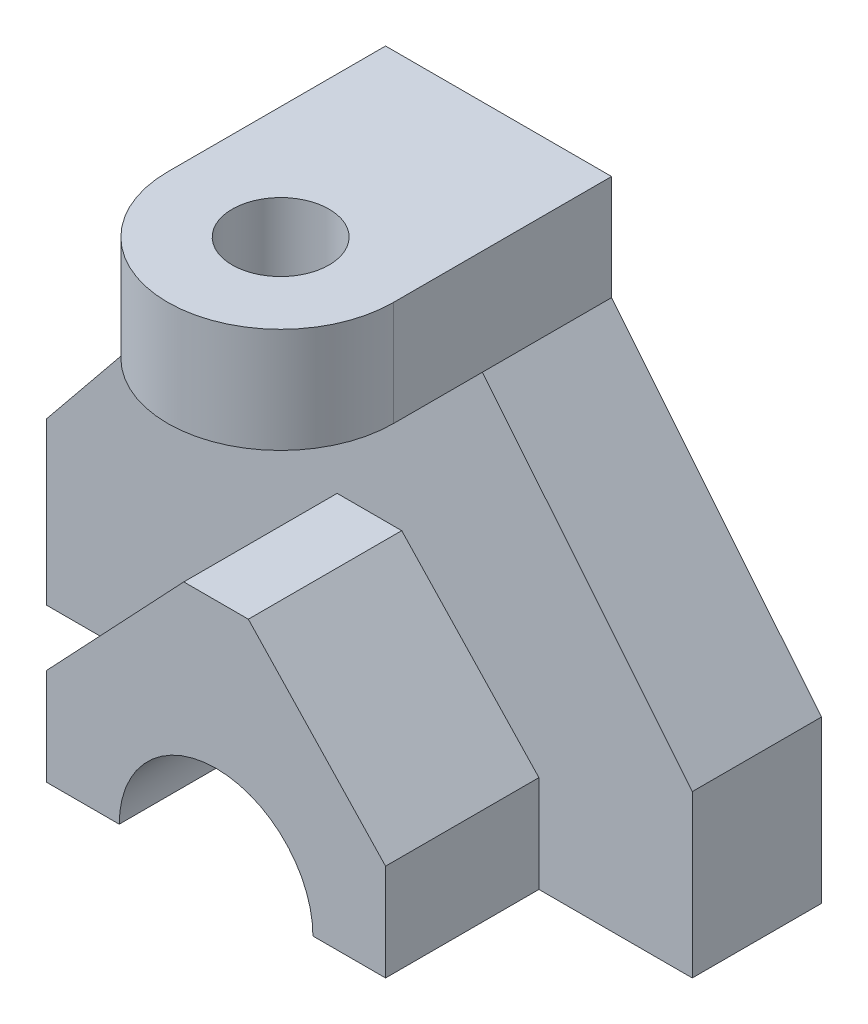
ISO-10303-21;
HEADER;
FILE_DESCRIPTION(('STEP AP214'),'2;1');
FILE_NAME('part.step','',(''),(''),'','','');
FILE_SCHEMA(('AUTOMOTIVE_DESIGN { 1 0 10303 214 1 1 1 1 }'));
ENDSEC;
DATA;
#1=APPLICATION_CONTEXT('core data for automotive mechanical design processes');
#2=APPLICATION_PROTOCOL_DEFINITION('international standard','automotive_design',2000,#1);
#3=PRODUCT_CONTEXT('',#1,'mechanical');
#4=PRODUCT('Part','Part','',(#3));
#5=PRODUCT_RELATED_PRODUCT_CATEGORY('part','',(#4));
#6=PRODUCT_DEFINITION_FORMATION('','',#4);
#7=PRODUCT_DEFINITION_CONTEXT('part definition',#1,'design');
#8=PRODUCT_DEFINITION('design','',#6,#7);
#9=PRODUCT_DEFINITION_SHAPE('','',#8);
#10=(LENGTH_UNIT() NAMED_UNIT(*) SI_UNIT(.MILLI.,.METRE.));
#11=(NAMED_UNIT(*) PLANE_ANGLE_UNIT() SI_UNIT($,.RADIAN.));
#12=(NAMED_UNIT(*) SI_UNIT($,.STERADIAN.) SOLID_ANGLE_UNIT());
#13=UNCERTAINTY_MEASURE_WITH_UNIT(LENGTH_MEASURE(1.E-05),#10,'distance_accuracy_value','');
#14=(GEOMETRIC_REPRESENTATION_CONTEXT(3) GLOBAL_UNCERTAINTY_ASSIGNED_CONTEXT((#13)) GLOBAL_UNIT_ASSIGNED_CONTEXT((#10,
#11,#12)) REPRESENTATION_CONTEXT('',''));
#15=CARTESIAN_POINT('',(0.,0.,0.));
#16=DIRECTION('',(0.,0.,1.));
#17=DIRECTION('',(1.,0.,0.));
#18=AXIS2_PLACEMENT_3D('',#15,#16,#17);
#19=CARTESIAN_POINT('',(0.,0.,16.));
#20=DIRECTION('',(0.,1.,0.));
#21=DIRECTION('',(0.,0.,1.));
#22=AXIS2_PLACEMENT_3D('',#19,#20,#21);
#23=PLANE('',#22);
#24=DIRECTION('',(1.,0.,0.));
#25=VECTOR('',#24,1.);
#26=CARTESIAN_POINT('',(0.,0.,0.));
#27=LINE('',#26,#25);
#28=CARTESIAN_POINT('',(-40.,0.,0.));
#29=VERTEX_POINT('',#28);
#30=CARTESIAN_POINT('',(-12.,0.,0.));
#31=VERTEX_POINT('',#30);
#32=EDGE_CURVE('E176',#29,#31,#27,.T.);
#33=ORIENTED_EDGE('',*,*,#32,.T.);
#34=DIRECTION('',(0.,0.,1.));
#35=VECTOR('',#34,1.);
#36=CARTESIAN_POINT('',(-12.,0.,0.));
#37=LINE('',#36,#35);
#38=CARTESIAN_POINT('',(-12.,0.,35.));
#39=VERTEX_POINT('',#38);
#40=EDGE_CURVE('E160',#31,#39,#37,.T.);
#41=ORIENTED_EDGE('',*,*,#40,.T.);
#42=DIRECTION('',(1.,0.,0.));
#43=VECTOR('',#42,1.);
#44=CARTESIAN_POINT('',(0.,0.,35.));
#45=LINE('',#44,#43);
#46=CARTESIAN_POINT('',(-21.,0.,35.));
#47=VERTEX_POINT('',#46);
#48=EDGE_CURVE('E304',#47,#39,#45,.T.);
#49=ORIENTED_EDGE('',*,*,#48,.F.);
#50=DIRECTION('',(0.,0.,-1.));
#51=VECTOR('',#50,1.);
#52=CARTESIAN_POINT('',(-21.,0.,35.));
#53=LINE('',#52,#51);
#54=CARTESIAN_POINT('',(-21.,0.,16.));
#55=VERTEX_POINT('',#54);
#56=EDGE_CURVE('E300',#47,#55,#53,.T.);
#57=ORIENTED_EDGE('',*,*,#56,.T.);
#58=DIRECTION('',(1.,0.,0.));
#59=VECTOR('',#58,1.);
#60=CARTESIAN_POINT('',(0.,0.,16.));
#61=LINE('',#60,#59);
#62=CARTESIAN_POINT('',(-40.,0.,16.));
#63=VERTEX_POINT('',#62);
#64=EDGE_CURVE('E198',#63,#55,#61,.T.);
#65=ORIENTED_EDGE('',*,*,#64,.F.);
#66=DIRECTION('',(0.,0.,-1.));
#67=VECTOR('',#66,1.);
#68=CARTESIAN_POINT('',(-40.,0.,16.));
#69=LINE('',#68,#67);
#70=EDGE_CURVE('E184',#63,#29,#69,.T.);
#71=ORIENTED_EDGE('',*,*,#70,.T.);
#72=EDGE_LOOP('',(#33,#41,#49,#57,#65,#71));
#73=FACE_BOUND('',#72,.T.);
#74=ADVANCED_FACE('F42',(#73),#23,.F.);
#75=CARTESIAN_POINT('',(0.,0.,16.));
#76=DIRECTION('',(0.,0.,1.));
#77=DIRECTION('',(1.,0.,0.));
#78=AXIS2_PLACEMENT_3D('',#75,#76,#77);
#79=PLANE('',#78);
#80=DIRECTION('',(0.,-1.,0.));
#81=VECTOR('',#80,1.);
#82=CARTESIAN_POINT('',(21.,0.,16.));
#83=LINE('',#82,#81);
#84=CARTESIAN_POINT('',(21.,12.,16.));
#85=VERTEX_POINT('',#84);
#86=CARTESIAN_POINT('',(21.,0.,16.));
#87=VERTEX_POINT('',#86);
#88=EDGE_CURVE('E342',#85,#87,#83,.T.);
#89=ORIENTED_EDGE('',*,*,#88,.T.);
#90=CARTESIAN_POINT('',(40.,0.,16.));
#91=VERTEX_POINT('',#90);
#92=EDGE_CURVE('E221',#87,#91,#61,.T.);
#93=ORIENTED_EDGE('',*,*,#92,.T.);
#94=DIRECTION('',(0.,-1.,0.));
#95=VECTOR('',#94,1.);
#96=CARTESIAN_POINT('',(40.,0.,16.));
#97=LINE('',#96,#95);
#98=CARTESIAN_POINT('',(40.,20.,16.));
#99=VERTEX_POINT('',#98);
#100=EDGE_CURVE('E236',#99,#91,#97,.T.);
#101=ORIENTED_EDGE('',*,*,#100,.F.);
#102=DIRECTION('',(0.630592625094466,-0.776114000116265,0.));
#103=VECTOR('',#102,1.);
#104=CARTESIAN_POINT('',(14.,52.,16.));
#105=LINE('',#104,#103);
#106=CARTESIAN_POINT('',(14.,52.,16.));
#107=VERTEX_POINT('',#106);
#108=EDGE_CURVE('E231',#107,#99,#105,.T.);
#109=ORIENTED_EDGE('',*,*,#108,.F.);
#110=DIRECTION('',(-1.,0.,0.));
#111=VECTOR('',#110,1.);
#112=CARTESIAN_POINT('',(0.,52.,16.));
#113=LINE('',#112,#111);
#114=CARTESIAN_POINT('',(-14.,52.,16.));
#115=VERTEX_POINT('',#114);
#116=EDGE_CURVE('E186',#107,#115,#113,.T.);
#117=ORIENTED_EDGE('',*,*,#116,.T.);
#118=DIRECTION('',(-0.630592625094466,-0.776114000116265,0.));
#119=VECTOR('',#118,1.);
#120=CARTESIAN_POINT('',(-14.,52.,16.));
#121=LINE('',#120,#119);
#122=CARTESIAN_POINT('',(-40.,20.,16.));
#123=VERTEX_POINT('',#122);
#124=EDGE_CURVE('E191',#115,#123,#121,.T.);
#125=ORIENTED_EDGE('',*,*,#124,.T.);
#126=DIRECTION('',(0.,-1.,0.));
#127=VECTOR('',#126,1.);
#128=CARTESIAN_POINT('',(-40.,0.,16.));
#129=LINE('',#128,#127);
#130=EDGE_CURVE('E205',#123,#63,#129,.T.);
#131=ORIENTED_EDGE('',*,*,#130,.T.);
#132=ORIENTED_EDGE('',*,*,#64,.T.);
#133=DIRECTION('',(0.,-1.,0.));
#134=VECTOR('',#133,1.);
#135=CARTESIAN_POINT('',(-21.,0.,16.));
#136=LINE('',#135,#134);
#137=CARTESIAN_POINT('',(-21.,12.,16.));
#138=VERTEX_POINT('',#137);
#139=EDGE_CURVE('E305',#138,#55,#136,.T.);
#140=ORIENTED_EDGE('',*,*,#139,.F.);
#141=DIRECTION('',(-0.686623532963716,-0.727013152549817,0.));
#142=VECTOR('',#141,1.);
#143=CARTESIAN_POINT('',(-21.,12.,16.));
#144=LINE('',#143,#142);
#145=CARTESIAN_POINT('',(-4.,30.,16.));
#146=VERTEX_POINT('',#145);
#147=EDGE_CURVE('E66',#146,#138,#144,.T.);
#148=ORIENTED_EDGE('',*,*,#147,.F.);
#149=DIRECTION('',(-1.,0.,0.));
#150=VECTOR('',#149,1.);
#151=CARTESIAN_POINT('',(0.,30.,16.));
#152=LINE('',#151,#150);
#153=CARTESIAN_POINT('',(4.,30.,16.));
#154=VERTEX_POINT('',#153);
#155=EDGE_CURVE('E312',#154,#146,#152,.T.);
#156=ORIENTED_EDGE('',*,*,#155,.F.);
#157=DIRECTION('',(0.686623532963716,-0.727013152549817,0.));
#158=VECTOR('',#157,1.);
#159=CARTESIAN_POINT('',(21.,12.,16.));
#160=LINE('',#159,#158);
#161=EDGE_CURVE('E337',#154,#85,#160,.T.);
#162=ORIENTED_EDGE('',*,*,#161,.T.);
#163=EDGE_LOOP('',(#89,#93,#101,#109,#117,#125,#131,#132,#140,#148,#156,#162));
#164=FACE_BOUND('',#163,.T.);
#165=ADVANCED_FACE('F384',(#164),#79,.T.);
#166=CARTESIAN_POINT('',(-14.,52.,16.));
#167=DIRECTION('',(0.776114000116266,-0.630592625094466,0.));
#168=DIRECTION('',(0.630592625094466,0.776114000116266,0.));
#169=AXIS2_PLACEMENT_3D('',#166,#167,#168);
#170=PLANE('',#169);
#171=DIRECTION('',(-0.630592625094466,-0.776114000116265,0.));
#172=VECTOR('',#171,1.);
#173=CARTESIAN_POINT('',(-14.,52.,0.));
#174=LINE('',#173,#172);
#175=CARTESIAN_POINT('',(-14.,52.,0.));
#176=VERTEX_POINT('',#175);
#177=CARTESIAN_POINT('',(-40.,20.,0.));
#178=VERTEX_POINT('',#177);
#179=EDGE_CURVE('E210',#176,#178,#174,.T.);
#180=ORIENTED_EDGE('',*,*,#179,.T.);
#181=DIRECTION('',(0.,0.,-1.));
#182=VECTOR('',#181,1.);
#183=CARTESIAN_POINT('',(-40.,20.,16.));
#184=LINE('',#183,#182);
#185=EDGE_CURVE('E51',#123,#178,#184,.T.);
#186=ORIENTED_EDGE('',*,*,#185,.F.);
#187=ORIENTED_EDGE('',*,*,#124,.F.);
#188=DIRECTION('',(0.,0.,-1.));
#189=VECTOR('',#188,1.);
#190=CARTESIAN_POINT('',(-14.,52.,16.));
#191=LINE('',#190,#189);
#192=EDGE_CURVE('E11',#115,#176,#191,.T.);
#193=ORIENTED_EDGE('',*,*,#192,.T.);
#194=EDGE_LOOP('',(#180,#186,#187,#193));
#195=FACE_BOUND('',#194,.T.);
#196=ADVANCED_FACE('F44',(#195),#170,.F.);
#197=CARTESIAN_POINT('',(-40.,0.,16.));
#198=DIRECTION('',(1.,0.,0.));
#199=DIRECTION('',(0.,0.,-1.));
#200=AXIS2_PLACEMENT_3D('',#197,#198,#199);
#201=PLANE('',#200);
#202=DIRECTION('',(0.,-1.,0.));
#203=VECTOR('',#202,1.);
#204=CARTESIAN_POINT('',(-40.,0.,0.));
#205=LINE('',#204,#203);
#206=EDGE_CURVE('E193',#178,#29,#205,.T.);
#207=ORIENTED_EDGE('',*,*,#206,.T.);
#208=ORIENTED_EDGE('',*,*,#70,.F.);
#209=ORIENTED_EDGE('',*,*,#130,.F.);
#210=ORIENTED_EDGE('',*,*,#185,.T.);
#211=EDGE_LOOP('',(#207,#208,#209,#210));
#212=FACE_BOUND('',#211,.T.);
#213=ADVANCED_FACE('F204',(#212),#201,.F.);
#214=CARTESIAN_POINT('',(12.,0.,35.));
#215=VERTEX_POINT('',#214);
#216=CARTESIAN_POINT('',(21.,0.,35.));
#217=VERTEX_POINT('',#216);
#218=EDGE_CURVE('E318',#215,#217,#45,.T.);
#219=ORIENTED_EDGE('',*,*,#218,.F.);
#220=DIRECTION('',(0.,0.,1.));
#221=VECTOR('',#220,1.);
#222=CARTESIAN_POINT('',(12.,0.,0.));
#223=LINE('',#222,#221);
#224=CARTESIAN_POINT('',(12.,0.,0.));
#225=VERTEX_POINT('',#224);
#226=EDGE_CURVE('E58',#225,#215,#223,.T.);
#227=ORIENTED_EDGE('',*,*,#226,.F.);
#228=CARTESIAN_POINT('',(40.,0.,0.));
#229=VERTEX_POINT('',#228);
#230=EDGE_CURVE('E178',#225,#229,#27,.T.);
#231=ORIENTED_EDGE('',*,*,#230,.T.);
#232=DIRECTION('',(0.,0.,-1.));
#233=VECTOR('',#232,1.);
#234=CARTESIAN_POINT('',(40.,0.,16.));
#235=LINE('',#234,#233);
#236=EDGE_CURVE('E213',#91,#229,#235,.T.);
#237=ORIENTED_EDGE('',*,*,#236,.F.);
#238=ORIENTED_EDGE('',*,*,#92,.F.);
#239=DIRECTION('',(0.,0.,-1.));
#240=VECTOR('',#239,1.);
#241=CARTESIAN_POINT('',(21.,0.,35.));
#242=LINE('',#241,#240);
#243=EDGE_CURVE('E315',#217,#87,#242,.T.);
#244=ORIENTED_EDGE('',*,*,#243,.F.);
#245=EDGE_LOOP('',(#219,#227,#231,#237,#238,#244));
#246=FACE_BOUND('',#245,.T.);
#247=ADVANCED_FACE('F364',(#246),#23,.F.);
#248=CARTESIAN_POINT('',(0.,0.,0.));
#249=DIRECTION('',(0.,0.,1.));
#250=DIRECTION('',(1.,0.,0.));
#251=AXIS2_PLACEMENT_3D('',#248,#249,#250);
#252=PLANE('',#251);
#253=ORIENTED_EDGE('',*,*,#230,.F.);
#254=CARTESIAN_POINT('',(0.,0.,0.));
#255=DIRECTION('',(0.,0.,1.));
#256=DIRECTION('',(1.,0.,0.));
#257=AXIS2_PLACEMENT_3D('',#254,#255,#256);
#258=CIRCLE('',#257,12.);
#259=EDGE_CURVE('E163',#225,#31,#258,.T.);
#260=ORIENTED_EDGE('',*,*,#259,.T.);
#261=ORIENTED_EDGE('',*,*,#32,.F.);
#262=ORIENTED_EDGE('',*,*,#206,.F.);
#263=ORIENTED_EDGE('',*,*,#179,.F.);
#264=DIRECTION('',(0.,-1.,0.));
#265=VECTOR('',#264,1.);
#266=CARTESIAN_POINT('',(-14.,65.,0.));
#267=LINE('',#266,#265);
#268=CARTESIAN_POINT('',(-14.,65.,0.));
#269=VERTEX_POINT('',#268);
#270=EDGE_CURVE('E240',#269,#176,#267,.T.);
#271=ORIENTED_EDGE('',*,*,#270,.F.);
#272=DIRECTION('',(-1.,0.,0.));
#273=VECTOR('',#272,1.);
#274=CARTESIAN_POINT('',(-14.,65.,0.));
#275=LINE('',#274,#273);
#276=CARTESIAN_POINT('',(14.,65.,0.));
#277=VERTEX_POINT('',#276);
#278=EDGE_CURVE('E266',#277,#269,#275,.T.);
#279=ORIENTED_EDGE('',*,*,#278,.F.);
#280=DIRECTION('',(0.,-1.,0.));
#281=VECTOR('',#280,1.);
#282=CARTESIAN_POINT('',(14.,65.,0.));
#283=LINE('',#282,#281);
#284=CARTESIAN_POINT('',(14.,52.,0.));
#285=VERTEX_POINT('',#284);
#286=EDGE_CURVE('E257',#277,#285,#283,.T.);
#287=ORIENTED_EDGE('',*,*,#286,.T.);
#288=DIRECTION('',(0.630592625094466,-0.776114000116265,0.));
#289=VECTOR('',#288,1.);
#290=CARTESIAN_POINT('',(14.,52.,0.));
#291=LINE('',#290,#289);
#292=CARTESIAN_POINT('',(40.,20.,0.));
#293=VERTEX_POINT('',#292);
#294=EDGE_CURVE('E232',#285,#293,#291,.T.);
#295=ORIENTED_EDGE('',*,*,#294,.T.);
#296=DIRECTION('',(0.,-1.,0.));
#297=VECTOR('',#296,1.);
#298=CARTESIAN_POINT('',(40.,0.,0.));
#299=LINE('',#298,#297);
#300=EDGE_CURVE('E237',#293,#229,#299,.T.);
#301=ORIENTED_EDGE('',*,*,#300,.T.);
#302=EDGE_LOOP('',(#253,#260,#261,#262,#263,#271,#279,#287,#295,#301));
#303=FACE_BOUND('',#302,.T.);
#304=ADVANCED_FACE('F174',(#303),#252,.F.);
#305=CARTESIAN_POINT('',(40.,0.,16.));
#306=DIRECTION('',(1.,0.,0.));
#307=DIRECTION('',(0.,0.,-1.));
#308=AXIS2_PLACEMENT_3D('',#305,#306,#307);
#309=PLANE('',#308);
#310=ORIENTED_EDGE('',*,*,#300,.F.);
#311=DIRECTION('',(0.,0.,-1.));
#312=VECTOR('',#311,1.);
#313=CARTESIAN_POINT('',(40.,20.,16.));
#314=LINE('',#313,#312);
#315=EDGE_CURVE('E216',#99,#293,#314,.T.);
#316=ORIENTED_EDGE('',*,*,#315,.F.);
#317=ORIENTED_EDGE('',*,*,#100,.T.);
#318=ORIENTED_EDGE('',*,*,#236,.T.);
#319=EDGE_LOOP('',(#310,#316,#317,#318));
#320=FACE_BOUND('',#319,.T.);
#321=ADVANCED_FACE('F412',(#320),#309,.T.);
#322=CARTESIAN_POINT('',(14.,52.,16.));
#323=DIRECTION('',(0.776114000116266,0.630592625094466,0.));
#324=DIRECTION('',(-0.630592625094466,0.776114000116266,0.));
#325=AXIS2_PLACEMENT_3D('',#322,#323,#324);
#326=PLANE('',#325);
#327=ORIENTED_EDGE('',*,*,#294,.F.);
#328=DIRECTION('',(0.,0.,-1.));
#329=VECTOR('',#328,1.);
#330=CARTESIAN_POINT('',(14.,52.,16.));
#331=LINE('',#330,#329);
#332=EDGE_CURVE('E228',#107,#285,#331,.T.);
#333=ORIENTED_EDGE('',*,*,#332,.F.);
#334=ORIENTED_EDGE('',*,*,#108,.T.);
#335=ORIENTED_EDGE('',*,*,#315,.T.);
#336=EDGE_LOOP('',(#327,#333,#334,#335));
#337=FACE_BOUND('',#336,.T.);
#338=ADVANCED_FACE('F408',(#337),#326,.T.);
#339=CARTESIAN_POINT('',(-14.,65.,0.));
#340=DIRECTION('',(1.,0.,0.));
#341=DIRECTION('',(0.,0.,-1.));
#342=AXIS2_PLACEMENT_3D('',#339,#340,#341);
#343=PLANE('',#342);
#344=ORIENTED_EDGE('',*,*,#192,.F.);
#345=DIRECTION('',(0.,0.,1.));
#346=VECTOR('',#345,1.);
#347=CARTESIAN_POINT('',(-14.,52.,0.));
#348=LINE('',#347,#346);
#349=CARTESIAN_POINT('',(-14.,52.,27.));
#350=VERTEX_POINT('',#349);
#351=EDGE_CURVE('E270',#115,#350,#348,.T.);
#352=ORIENTED_EDGE('',*,*,#351,.T.);
#353=DIRECTION('',(0.,-1.,0.));
#354=VECTOR('',#353,1.);
#355=CARTESIAN_POINT('',(-14.,65.,27.));
#356=LINE('',#355,#354);
#357=CARTESIAN_POINT('',(-14.,65.,27.));
#358=VERTEX_POINT('',#357);
#359=EDGE_CURVE('E249',#358,#350,#356,.T.);
#360=ORIENTED_EDGE('',*,*,#359,.F.);
#361=DIRECTION('',(0.,0.,1.));
#362=VECTOR('',#361,1.);
#363=CARTESIAN_POINT('',(-14.,65.,0.));
#364=LINE('',#363,#362);
#365=EDGE_CURVE('E279',#269,#358,#364,.T.);
#366=ORIENTED_EDGE('',*,*,#365,.F.);
#367=ORIENTED_EDGE('',*,*,#270,.T.);
#368=EDGE_LOOP('',(#344,#352,#360,#366,#367));
#369=FACE_BOUND('',#368,.T.);
#370=ADVANCED_FACE('F388',(#369),#343,.F.);
#371=CARTESIAN_POINT('',(0.,65.,27.));
#372=DIRECTION('',(0.,-1.,0.));
#373=DIRECTION('',(0.,0.,-1.));
#374=AXIS2_PLACEMENT_3D('',#371,#372,#373);
#375=CYLINDRICAL_SURFACE('',#374,14.);
#376=CARTESIAN_POINT('',(0.,52.,27.));
#377=DIRECTION('',(0.,1.,0.));
#378=DIRECTION('',(0.,0.,1.));
#379=AXIS2_PLACEMENT_3D('',#376,#377,#378);
#380=CIRCLE('',#379,14.);
#381=CARTESIAN_POINT('',(14.,52.,27.));
#382=VERTEX_POINT('',#381);
#383=EDGE_CURVE('E267',#350,#382,#380,.T.);
#384=ORIENTED_EDGE('',*,*,#383,.T.);
#385=DIRECTION('',(0.,-1.,0.));
#386=VECTOR('',#385,1.);
#387=CARTESIAN_POINT('',(14.,65.,27.));
#388=LINE('',#387,#386);
#389=CARTESIAN_POINT('',(14.,65.,27.));
#390=VERTEX_POINT('',#389);
#391=EDGE_CURVE('E253',#390,#382,#388,.T.);
#392=ORIENTED_EDGE('',*,*,#391,.F.);
#393=CARTESIAN_POINT('',(0.,65.,27.));
#394=DIRECTION('',(0.,1.,0.));
#395=DIRECTION('',(0.,0.,1.));
#396=AXIS2_PLACEMENT_3D('',#393,#394,#395);
#397=CIRCLE('',#396,14.);
#398=EDGE_CURVE('E276',#358,#390,#397,.T.);
#399=ORIENTED_EDGE('',*,*,#398,.F.);
#400=ORIENTED_EDGE('',*,*,#359,.T.);
#401=EDGE_LOOP('',(#384,#392,#399,#400));
#402=FACE_BOUND('',#401,.T.);
#403=ADVANCED_FACE('F396',(#402),#375,.T.);
#404=CARTESIAN_POINT('',(14.,65.,0.));
#405=DIRECTION('',(-1.,0.,0.));
#406=DIRECTION('',(0.,0.,1.));
#407=AXIS2_PLACEMENT_3D('',#404,#405,#406);
#408=PLANE('',#407);
#409=DIRECTION('',(0.,0.,-1.));
#410=VECTOR('',#409,1.);
#411=CARTESIAN_POINT('',(14.,52.,0.));
#412=LINE('',#411,#410);
#413=EDGE_CURVE('E262',#382,#107,#412,.T.);
#414=ORIENTED_EDGE('',*,*,#413,.T.);
#415=ORIENTED_EDGE('',*,*,#332,.T.);
#416=ORIENTED_EDGE('',*,*,#286,.F.);
#417=DIRECTION('',(0.,0.,-1.));
#418=VECTOR('',#417,1.);
#419=CARTESIAN_POINT('',(14.,65.,0.));
#420=LINE('',#419,#418);
#421=EDGE_CURVE('E261',#390,#277,#420,.T.);
#422=ORIENTED_EDGE('',*,*,#421,.F.);
#423=ORIENTED_EDGE('',*,*,#391,.T.);
#424=EDGE_LOOP('',(#414,#415,#416,#422,#423));
#425=FACE_BOUND('',#424,.T.);
#426=ADVANCED_FACE('F400',(#425),#408,.F.);
#427=CARTESIAN_POINT('',(0.,65.,27.));
#428=DIRECTION('',(0.,1.,0.));
#429=DIRECTION('',(0.,0.,1.));
#430=AXIS2_PLACEMENT_3D('',#427,#428,#429);
#431=PLANE('',#430);
#432=CARTESIAN_POINT('',(0.,65.,27.));
#433=DIRECTION('',(0.,1.,0.));
#434=DIRECTION('',(0.,0.,1.));
#435=AXIS2_PLACEMENT_3D('',#432,#433,#434);
#436=CIRCLE('',#435,6.);
#437=CARTESIAN_POINT('',(0.,65.,33.));
#438=VERTEX_POINT('',#437);
#439=EDGE_CURVE('E285',#438,#438,#436,.T.);
#440=ORIENTED_EDGE('',*,*,#439,.F.);
#441=EDGE_LOOP('',(#440));
#442=FACE_BOUND('',#441,.T.);
#443=ORIENTED_EDGE('',*,*,#278,.T.);
#444=ORIENTED_EDGE('',*,*,#365,.T.);
#445=ORIENTED_EDGE('',*,*,#398,.T.);
#446=ORIENTED_EDGE('',*,*,#421,.T.);
#447=EDGE_LOOP('',(#443,#444,#445,#446));
#448=FACE_BOUND('',#447,.T.);
#449=ADVANCED_FACE('F405',(#442,#448),#431,.T.);
#450=CARTESIAN_POINT('',(0.,52.,27.));
#451=DIRECTION('',(0.,1.,0.));
#452=DIRECTION('',(0.,0.,1.));
#453=AXIS2_PLACEMENT_3D('',#450,#451,#452);
#454=PLANE('',#453);
#455=CARTESIAN_POINT('',(0.,52.,27.));
#456=DIRECTION('',(0.,1.,0.));
#457=DIRECTION('',(0.,0.,1.));
#458=AXIS2_PLACEMENT_3D('',#455,#456,#457);
#459=CIRCLE('',#458,6.);
#460=CARTESIAN_POINT('',(0.,52.,33.));
#461=VERTEX_POINT('',#460);
#462=EDGE_CURVE('E273',#461,#461,#459,.T.);
#463=ORIENTED_EDGE('',*,*,#462,.T.);
#464=EDGE_LOOP('',(#463));
#465=FACE_BOUND('',#464,.T.);
#466=ORIENTED_EDGE('',*,*,#116,.F.);
#467=ORIENTED_EDGE('',*,*,#413,.F.);
#468=ORIENTED_EDGE('',*,*,#383,.F.);
#469=ORIENTED_EDGE('',*,*,#351,.F.);
#470=EDGE_LOOP('',(#466,#467,#468,#469));
#471=FACE_BOUND('',#470,.T.);
#472=ADVANCED_FACE('F392',(#465,#471),#454,.F.);
#473=CARTESIAN_POINT('',(0.,52.,27.));
#474=DIRECTION('',(0.,1.,0.));
#475=DIRECTION('',(0.,0.,1.));
#476=AXIS2_PLACEMENT_3D('',#473,#474,#475);
#477=CYLINDRICAL_SURFACE('',#476,6.);
#478=CARTESIAN_POINT('',(0.,52.,33.));
#479=CARTESIAN_POINT('',(0.,52.1354166666667,33.));
#480=CARTESIAN_POINT('',(0.,52.2708333333333,33.));
#481=CARTESIAN_POINT('',(0.,52.5416666666667,33.));
#482=CARTESIAN_POINT('',(0.,52.6770833333333,33.));
#483=CARTESIAN_POINT('',(0.,52.9479166666667,33.));
#484=CARTESIAN_POINT('',(0.,53.0833333333333,33.));
#485=CARTESIAN_POINT('',(0.,53.3541666666667,33.));
#486=CARTESIAN_POINT('',(0.,53.4895833333333,33.));
#487=CARTESIAN_POINT('',(0.,53.7604166666667,33.));
#488=CARTESIAN_POINT('',(0.,53.8958333333333,33.));
#489=CARTESIAN_POINT('',(0.,54.1666666666667,33.));
#490=CARTESIAN_POINT('',(0.,54.3020833333333,33.));
#491=CARTESIAN_POINT('',(0.,54.5729166666667,33.));
#492=CARTESIAN_POINT('',(0.,54.7083333333333,33.));
#493=CARTESIAN_POINT('',(0.,54.9791666666667,33.));
#494=CARTESIAN_POINT('',(0.,55.1145833333333,33.));
#495=CARTESIAN_POINT('',(0.,55.3854166666667,33.));
#496=CARTESIAN_POINT('',(0.,55.5208333333333,33.));
#497=CARTESIAN_POINT('',(0.,55.7916666666667,33.));
#498=CARTESIAN_POINT('',(0.,55.9270833333333,33.));
#499=CARTESIAN_POINT('',(0.,56.1979166666667,33.));
#500=CARTESIAN_POINT('',(0.,56.3333333333333,33.));
#501=CARTESIAN_POINT('',(0.,56.6041666666667,33.));
#502=CARTESIAN_POINT('',(0.,56.7395833333333,33.));
#503=CARTESIAN_POINT('',(0.,57.0104166666667,33.));
#504=CARTESIAN_POINT('',(0.,57.1458333333333,33.));
#505=CARTESIAN_POINT('',(0.,57.4166666666667,33.));
#506=CARTESIAN_POINT('',(0.,57.5520833333333,33.));
#507=CARTESIAN_POINT('',(0.,57.8229166666667,33.));
#508=CARTESIAN_POINT('',(0.,57.9583333333333,33.));
#509=CARTESIAN_POINT('',(0.,58.2291666666667,33.));
#510=CARTESIAN_POINT('',(0.,58.3645833333333,33.));
#511=CARTESIAN_POINT('',(0.,58.6354166666667,33.));
#512=CARTESIAN_POINT('',(0.,58.7708333333333,33.));
#513=CARTESIAN_POINT('',(0.,59.0416666666667,33.));
#514=CARTESIAN_POINT('',(0.,59.1770833333333,33.));
#515=CARTESIAN_POINT('',(0.,59.4479166666667,33.));
#516=CARTESIAN_POINT('',(0.,59.5833333333333,33.));
#517=CARTESIAN_POINT('',(0.,59.8541666666667,33.));
#518=CARTESIAN_POINT('',(0.,59.9895833333333,33.));
#519=CARTESIAN_POINT('',(0.,60.2604166666667,33.));
#520=CARTESIAN_POINT('',(0.,60.3958333333333,33.));
#521=CARTESIAN_POINT('',(0.,60.6666666666667,33.));
#522=CARTESIAN_POINT('',(0.,60.8020833333333,33.));
#523=CARTESIAN_POINT('',(0.,61.0729166666667,33.));
#524=CARTESIAN_POINT('',(0.,61.2083333333333,33.));
#525=CARTESIAN_POINT('',(0.,61.4791666666667,33.));
#526=CARTESIAN_POINT('',(0.,61.6145833333333,33.));
#527=CARTESIAN_POINT('',(0.,61.8854166666667,33.));
#528=CARTESIAN_POINT('',(0.,62.0208333333333,33.));
#529=CARTESIAN_POINT('',(0.,62.2916666666667,33.));
#530=CARTESIAN_POINT('',(0.,62.4270833333333,33.));
#531=CARTESIAN_POINT('',(0.,62.6979166666667,33.));
#532=CARTESIAN_POINT('',(0.,62.8333333333333,33.));
#533=CARTESIAN_POINT('',(0.,63.1041666666667,33.));
#534=CARTESIAN_POINT('',(0.,63.2395833333333,33.));
#535=CARTESIAN_POINT('',(0.,63.5104166666667,33.));
#536=CARTESIAN_POINT('',(0.,63.6458333333333,33.));
#537=CARTESIAN_POINT('',(0.,63.9166666666667,33.));
#538=CARTESIAN_POINT('',(0.,64.0520833333333,33.));
#539=CARTESIAN_POINT('',(0.,64.3229166666667,33.));
#540=CARTESIAN_POINT('',(0.,64.4583333333333,33.));
#541=CARTESIAN_POINT('',(0.,64.7291666666667,33.));
#542=CARTESIAN_POINT('',(0.,64.8645833333333,33.));
#543=CARTESIAN_POINT('',(0.,65.,33.));
#544=B_SPLINE_CURVE_WITH_KNOTS('',3,(#478,#479,#480,#481,#482,#483,#484,#485,#486,#487,#488,
#489,#490,#491,#492,#493,#494,#495,#496,#497,#498,#499,#500,#501,#502,#503,#504,#505,#506,#507,
#508,#509,#510,#511,#512,#513,#514,#515,#516,#517,#518,#519,#520,#521,#522,#523,#524,#525,#526,
#527,#528,#529,#530,#531,#532,#533,#534,#535,#536,#537,#538,#539,#540,#541,#542,#543),
.UNSPECIFIED.,.F.,.F.,(4,2,2,2,2,2,2,2,2,2,2,2,2,2,2,2,2,2,2,2,2,2,2,2,2,2,2,2,2,2,2,2,4),(0.,
0.406249999999997,0.812499999999994,1.21875,1.62499999999999,2.03125,2.4375,2.84374999999999,
3.25,3.65624999999999,4.0625,4.46874999999999,4.87499999999999,5.28124999999999,
5.68749999999999,6.09374999999999,6.49999999999999,6.90624999999999,7.31249999999999,
7.71874999999999,8.12499999999999,8.53124999999999,8.93749999999999,9.34374999999999,
9.74999999999999,10.15625,10.5625,10.96875,11.375,11.78125,12.1875,12.59375,13.),.UNSPECIFIED.);
#545=EDGE_CURVE('BSEAM458',#461,#438,#544,.T.);
#546=ORIENTED_EDGE('',*,*,#462,.F.);
#547=ORIENTED_EDGE('',*,*,#439,.T.);
#548=ORIENTED_EDGE('',*,*,#545,.T.);
#549=ORIENTED_EDGE('',*,*,#545,.F.);
#550=EDGE_LOOP('',(#546,#548,#547,#549));
#551=FACE_BOUND('',#550,.T.);
#552=ADVANCED_FACE('F458',(#551),#477,.F.);
#553=CARTESIAN_POINT('',(0.,30.,35.));
#554=DIRECTION('',(0.,-1.,0.));
#555=DIRECTION('',(0.,0.,-1.));
#556=AXIS2_PLACEMENT_3D('',#553,#554,#555);
#557=PLANE('',#556);
#558=ORIENTED_EDGE('',*,*,#155,.T.);
#559=DIRECTION('',(0.,0.,-1.));
#560=VECTOR('',#559,1.);
#561=CARTESIAN_POINT('',(-4.,30.,35.));
#562=LINE('',#561,#560);
#563=CARTESIAN_POINT('',(-4.,30.,35.));
#564=VERTEX_POINT('',#563);
#565=EDGE_CURVE('E289',#564,#146,#562,.T.);
#566=ORIENTED_EDGE('',*,*,#565,.F.);
#567=DIRECTION('',(-1.,0.,0.));
#568=VECTOR('',#567,1.);
#569=CARTESIAN_POINT('',(0.,30.,35.));
#570=LINE('',#569,#568);
#571=CARTESIAN_POINT('',(4.,30.,35.));
#572=VERTEX_POINT('',#571);
#573=EDGE_CURVE('E309',#572,#564,#570,.T.);
#574=ORIENTED_EDGE('',*,*,#573,.F.);
#575=DIRECTION('',(0.,0.,-1.));
#576=VECTOR('',#575,1.);
#577=CARTESIAN_POINT('',(4.,30.,35.));
#578=LINE('',#577,#576);
#579=EDGE_CURVE('E332',#572,#154,#578,.T.);
#580=ORIENTED_EDGE('',*,*,#579,.T.);
#581=EDGE_LOOP('',(#558,#566,#574,#580));
#582=FACE_BOUND('',#581,.T.);
#583=ADVANCED_FACE('F377',(#582),#557,.F.);
#584=CARTESIAN_POINT('',(-21.,12.,35.));
#585=DIRECTION('',(0.727013152549818,-0.686623532963716,0.));
#586=DIRECTION('',(0.686623532963716,0.727013152549818,0.));
#587=AXIS2_PLACEMENT_3D('',#584,#585,#586);
#588=PLANE('',#587);
#589=ORIENTED_EDGE('',*,*,#147,.T.);
#590=DIRECTION('',(0.,0.,-1.));
#591=VECTOR('',#590,1.);
#592=CARTESIAN_POINT('',(-21.,12.,35.));
#593=LINE('',#592,#591);
#594=CARTESIAN_POINT('',(-21.,12.,35.));
#595=VERTEX_POINT('',#594);
#596=EDGE_CURVE('E296',#595,#138,#593,.T.);
#597=ORIENTED_EDGE('',*,*,#596,.F.);
#598=DIRECTION('',(-0.686623532963716,-0.727013152549817,0.));
#599=VECTOR('',#598,1.);
#600=CARTESIAN_POINT('',(-21.,12.,35.));
#601=LINE('',#600,#599);
#602=EDGE_CURVE('E322',#564,#595,#601,.T.);
#603=ORIENTED_EDGE('',*,*,#602,.F.);
#604=ORIENTED_EDGE('',*,*,#565,.T.);
#605=EDGE_LOOP('',(#589,#597,#603,#604));
#606=FACE_BOUND('',#605,.T.);
#607=ADVANCED_FACE('F379',(#606),#588,.F.);
#608=CARTESIAN_POINT('',(-21.,0.,35.));
#609=DIRECTION('',(1.,0.,0.));
#610=DIRECTION('',(0.,0.,-1.));
#611=AXIS2_PLACEMENT_3D('',#608,#609,#610);
#612=PLANE('',#611);
#613=ORIENTED_EDGE('',*,*,#139,.T.);
#614=ORIENTED_EDGE('',*,*,#56,.F.);
#615=DIRECTION('',(0.,-1.,0.));
#616=VECTOR('',#615,1.);
#617=CARTESIAN_POINT('',(-21.,0.,35.));
#618=LINE('',#617,#616);
#619=EDGE_CURVE('E319',#595,#47,#618,.T.);
#620=ORIENTED_EDGE('',*,*,#619,.F.);
#621=ORIENTED_EDGE('',*,*,#596,.T.);
#622=EDGE_LOOP('',(#613,#614,#620,#621));
#623=FACE_BOUND('',#622,.T.);
#624=ADVANCED_FACE('F383',(#623),#612,.F.);
#625=CARTESIAN_POINT('',(0.,0.,35.));
#626=DIRECTION('',(0.,0.,1.));
#627=DIRECTION('',(1.,0.,0.));
#628=AXIS2_PLACEMENT_3D('',#625,#626,#627);
#629=PLANE('',#628);
#630=CARTESIAN_POINT('',(0.,0.,35.));
#631=DIRECTION('',(0.,0.,1.));
#632=DIRECTION('',(1.,0.,0.));
#633=AXIS2_PLACEMENT_3D('',#630,#631,#632);
#634=CIRCLE('',#633,12.);
#635=EDGE_CURVE('E164',#215,#39,#634,.T.);
#636=ORIENTED_EDGE('',*,*,#635,.F.);
#637=ORIENTED_EDGE('',*,*,#218,.T.);
#638=DIRECTION('',(0.,-1.,0.));
#639=VECTOR('',#638,1.);
#640=CARTESIAN_POINT('',(21.,0.,35.));
#641=LINE('',#640,#639);
#642=CARTESIAN_POINT('',(21.,12.,35.));
#643=VERTEX_POINT('',#642);
#644=EDGE_CURVE('E341',#643,#217,#641,.T.);
#645=ORIENTED_EDGE('',*,*,#644,.F.);
#646=DIRECTION('',(0.686623532963716,-0.727013152549817,0.));
#647=VECTOR('',#646,1.);
#648=CARTESIAN_POINT('',(21.,12.,35.));
#649=LINE('',#648,#647);
#650=EDGE_CURVE('E336',#572,#643,#649,.T.);
#651=ORIENTED_EDGE('',*,*,#650,.F.);
#652=ORIENTED_EDGE('',*,*,#573,.T.);
#653=ORIENTED_EDGE('',*,*,#602,.T.);
#654=ORIENTED_EDGE('',*,*,#619,.T.);
#655=ORIENTED_EDGE('',*,*,#48,.T.);
#656=EDGE_LOOP('',(#636,#637,#645,#651,#652,#653,#654,#655));
#657=FACE_BOUND('',#656,.T.);
#658=ADVANCED_FACE('F360',(#657),#629,.T.);
#659=CARTESIAN_POINT('',(21.,0.,35.));
#660=DIRECTION('',(1.,0.,0.));
#661=DIRECTION('',(0.,0.,-1.));
#662=AXIS2_PLACEMENT_3D('',#659,#660,#661);
#663=PLANE('',#662);
#664=ORIENTED_EDGE('',*,*,#88,.F.);
#665=DIRECTION('',(0.,0.,-1.));
#666=VECTOR('',#665,1.);
#667=CARTESIAN_POINT('',(21.,12.,35.));
#668=LINE('',#667,#666);
#669=EDGE_CURVE('E329',#643,#85,#668,.T.);
#670=ORIENTED_EDGE('',*,*,#669,.F.);
#671=ORIENTED_EDGE('',*,*,#644,.T.);
#672=ORIENTED_EDGE('',*,*,#243,.T.);
#673=EDGE_LOOP('',(#664,#670,#671,#672));
#674=FACE_BOUND('',#673,.T.);
#675=ADVANCED_FACE('F368',(#674),#663,.T.);
#676=CARTESIAN_POINT('',(21.,12.,35.));
#677=DIRECTION('',(0.727013152549818,0.686623532963716,0.));
#678=DIRECTION('',(-0.686623532963716,0.727013152549818,0.));
#679=AXIS2_PLACEMENT_3D('',#676,#677,#678);
#680=PLANE('',#679);
#681=ORIENTED_EDGE('',*,*,#161,.F.);
#682=ORIENTED_EDGE('',*,*,#579,.F.);
#683=ORIENTED_EDGE('',*,*,#650,.T.);
#684=ORIENTED_EDGE('',*,*,#669,.T.);
#685=EDGE_LOOP('',(#681,#682,#683,#684));
#686=FACE_BOUND('',#685,.T.);
#687=ADVANCED_FACE('F371',(#686),#680,.T.);
#688=CARTESIAN_POINT('',(0.,0.,0.));
#689=DIRECTION('',(0.,0.,1.));
#690=DIRECTION('',(1.,0.,0.));
#691=AXIS2_PLACEMENT_3D('',#688,#689,#690);
#692=CYLINDRICAL_SURFACE('',#691,12.);
#693=ORIENTED_EDGE('',*,*,#635,.T.);
#694=ORIENTED_EDGE('',*,*,#40,.F.);
#695=ORIENTED_EDGE('',*,*,#259,.F.);
#696=ORIENTED_EDGE('',*,*,#226,.T.);
#697=EDGE_LOOP('',(#693,#694,#695,#696));
#698=FACE_BOUND('',#697,.T.);
#699=ADVANCED_FACE('F162',(#698),#692,.F.);
#700=CLOSED_SHELL('',(#74,#165,#196,#213,#247,#304,#321,#338,#370,#403,#426,#449,#472,#552,#583,
#607,#624,#658,#675,#687,#699));
#701=MANIFOLD_SOLID_BREP('B2',#700);
#702=ADVANCED_BREP_SHAPE_REPRESENTATION('',(#18,#701),#14);
#703=SHAPE_DEFINITION_REPRESENTATION(#9,#702);
ENDSEC;
END-ISO-10303-21;
